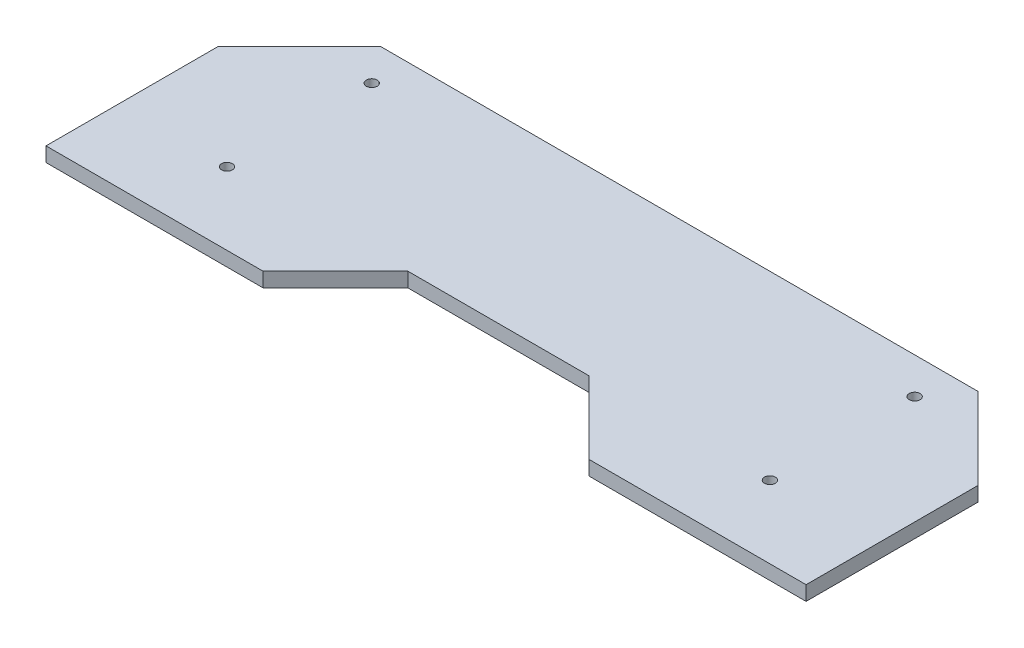
ISO-10303-21;
HEADER;
FILE_DESCRIPTION(('STEP AP214'),'2;1');
FILE_NAME('part.step','',(''),(''),'','','');
FILE_SCHEMA(('AUTOMOTIVE_DESIGN { 1 0 10303 214 1 1 1 1 }'));
ENDSEC;
DATA;
#1=APPLICATION_CONTEXT('core data for automotive mechanical design processes');
#2=APPLICATION_PROTOCOL_DEFINITION('international standard','automotive_design',2000,#1);
#3=PRODUCT_CONTEXT('',#1,'mechanical');
#4=PRODUCT('Part','Part','',(#3));
#5=PRODUCT_RELATED_PRODUCT_CATEGORY('part','',(#4));
#6=PRODUCT_DEFINITION_FORMATION('','',#4);
#7=PRODUCT_DEFINITION_CONTEXT('part definition',#1,'design');
#8=PRODUCT_DEFINITION('design','',#6,#7);
#9=PRODUCT_DEFINITION_SHAPE('','',#8);
#10=(LENGTH_UNIT() NAMED_UNIT(*) SI_UNIT(.MILLI.,.METRE.));
#11=(NAMED_UNIT(*) PLANE_ANGLE_UNIT() SI_UNIT($,.RADIAN.));
#12=(NAMED_UNIT(*) SI_UNIT($,.STERADIAN.) SOLID_ANGLE_UNIT());
#13=UNCERTAINTY_MEASURE_WITH_UNIT(LENGTH_MEASURE(1.E-05),#10,'distance_accuracy_value','');
#14=(GEOMETRIC_REPRESENTATION_CONTEXT(3) GLOBAL_UNCERTAINTY_ASSIGNED_CONTEXT((#13)) GLOBAL_UNIT_ASSIGNED_CONTEXT((#10,
#11,#12)) REPRESENTATION_CONTEXT('',''));
#15=CARTESIAN_POINT('',(0.,0.,0.));
#16=DIRECTION('',(0.,0.,1.));
#17=DIRECTION('',(1.,0.,0.));
#18=AXIS2_PLACEMENT_3D('',#15,#16,#17);
#19=CARTESIAN_POINT('',(-137.5,4.,35.));
#20=DIRECTION('',(0.,0.,-1.));
#21=DIRECTION('',(-1.,0.,0.));
#22=AXIS2_PLACEMENT_3D('',#19,#20,#21);
#23=PLANE('',#22);
#24=DIRECTION('',(1.,0.,0.));
#25=VECTOR('',#24,1.);
#26=CARTESIAN_POINT('',(-137.5,4.,35.));
#27=LINE('',#26,#25);
#28=CARTESIAN_POINT('',(-127.5,4.,35.));
#29=VERTEX_POINT('',#28);
#30=CARTESIAN_POINT('',(-67.4999999999999,4.,35.));
#31=VERTEX_POINT('',#30);
#32=EDGE_CURVE('E173',#29,#31,#27,.T.);
#33=ORIENTED_EDGE('',*,*,#32,.F.);
#34=DIRECTION('',(0.,1.,0.));
#35=VECTOR('',#34,1.);
#36=CARTESIAN_POINT('',(-127.5,0.,35.));
#37=LINE('',#36,#35);
#38=CARTESIAN_POINT('',(-127.5,0.,35.));
#39=VERTEX_POINT('',#38);
#40=EDGE_CURVE('E145',#39,#29,#37,.T.);
#41=ORIENTED_EDGE('',*,*,#40,.F.);
#42=DIRECTION('',(1.,0.,0.));
#43=VECTOR('',#42,1.);
#44=CARTESIAN_POINT('',(-137.5,0.,35.));
#45=LINE('',#44,#43);
#46=CARTESIAN_POINT('',(-67.4999999999999,0.,35.));
#47=VERTEX_POINT('',#46);
#48=EDGE_CURVE('E170',#39,#47,#45,.T.);
#49=ORIENTED_EDGE('',*,*,#48,.T.);
#50=DIRECTION('',(0.,-1.,0.));
#51=VECTOR('',#50,1.);
#52=CARTESIAN_POINT('',(-67.4999999999999,4.,35.));
#53=LINE('',#52,#51);
#54=EDGE_CURVE('E43',#31,#47,#53,.T.);
#55=ORIENTED_EDGE('',*,*,#54,.F.);
#56=EDGE_LOOP('',(#33,#41,#49,#55));
#57=FACE_BOUND('',#56,.T.);
#58=ADVANCED_FACE('F36',(#57),#23,.F.);
#59=CARTESIAN_POINT('',(-67.4999999999999,4.,35.));
#60=DIRECTION('',(-0.70710678118655,0.,-0.707106781186545));
#61=DIRECTION('',(-0.707106781186545,0.,0.70710678118655));
#62=AXIS2_PLACEMENT_3D('',#59,#60,#61);
#63=PLANE('',#62);
#64=DIRECTION('',(0.707106781186545,0.,-0.70710678118655));
#65=VECTOR('',#64,1.);
#66=CARTESIAN_POINT('',(-67.4999999999999,0.,35.));
#67=LINE('',#66,#65);
#68=CARTESIAN_POINT('',(-47.5,0.,15.));
#69=VERTEX_POINT('',#68);
#70=EDGE_CURVE('E187',#47,#69,#67,.T.);
#71=ORIENTED_EDGE('',*,*,#70,.T.);
#72=DIRECTION('',(0.,-1.,0.));
#73=VECTOR('',#72,1.);
#74=CARTESIAN_POINT('',(-47.5,4.,15.));
#75=LINE('',#74,#73);
#76=CARTESIAN_POINT('',(-47.5,4.,15.));
#77=VERTEX_POINT('',#76);
#78=EDGE_CURVE('E201',#77,#69,#75,.T.);
#79=ORIENTED_EDGE('',*,*,#78,.F.);
#80=DIRECTION('',(0.707106781186545,0.,-0.70710678118655));
#81=VECTOR('',#80,1.);
#82=CARTESIAN_POINT('',(-67.4999999999999,4.,35.));
#83=LINE('',#82,#81);
#84=EDGE_CURVE('E175',#31,#77,#83,.T.);
#85=ORIENTED_EDGE('',*,*,#84,.F.);
#86=ORIENTED_EDGE('',*,*,#54,.T.);
#87=EDGE_LOOP('',(#71,#79,#85,#86));
#88=FACE_BOUND('',#87,.T.);
#89=ADVANCED_FACE('F208',(#88),#63,.F.);
#90=CARTESIAN_POINT('',(-47.5,4.,15.));
#91=DIRECTION('',(0.,0.,-1.));
#92=DIRECTION('',(-1.,0.,0.));
#93=AXIS2_PLACEMENT_3D('',#90,#91,#92);
#94=PLANE('',#93);
#95=DIRECTION('',(1.,0.,0.));
#96=VECTOR('',#95,1.);
#97=CARTESIAN_POINT('',(-47.5,0.,15.));
#98=LINE('',#97,#96);
#99=CARTESIAN_POINT('',(2.49999999999997,0.,15.));
#100=VERTEX_POINT('',#99);
#101=EDGE_CURVE('E189',#69,#100,#98,.T.);
#102=ORIENTED_EDGE('',*,*,#101,.T.);
#103=DIRECTION('',(0.,-1.,0.));
#104=VECTOR('',#103,1.);
#105=CARTESIAN_POINT('',(2.49999999999997,4.,15.));
#106=LINE('',#105,#104);
#107=CARTESIAN_POINT('',(2.49999999999997,4.,15.));
#108=VERTEX_POINT('',#107);
#109=EDGE_CURVE('E198',#108,#100,#106,.T.);
#110=ORIENTED_EDGE('',*,*,#109,.F.);
#111=DIRECTION('',(1.,0.,0.));
#112=VECTOR('',#111,1.);
#113=CARTESIAN_POINT('',(-47.5,4.,15.));
#114=LINE('',#113,#112);
#115=EDGE_CURVE('E177',#77,#108,#114,.T.);
#116=ORIENTED_EDGE('',*,*,#115,.F.);
#117=ORIENTED_EDGE('',*,*,#78,.T.);
#118=EDGE_LOOP('',(#102,#110,#116,#117));
#119=FACE_BOUND('',#118,.T.);
#120=ADVANCED_FACE('F217',(#119),#94,.F.);
#121=CARTESIAN_POINT('',(22.5,4.,35.));
#122=DIRECTION('',(0.707106781186546,0.,-0.707106781186549));
#123=DIRECTION('',(-0.707106781186549,0.,-0.707106781186546));
#124=AXIS2_PLACEMENT_3D('',#121,#122,#123);
#125=PLANE('',#124);
#126=DIRECTION('',(0.707106781186549,0.,0.707106781186546));
#127=VECTOR('',#126,1.);
#128=CARTESIAN_POINT('',(22.5,0.,35.));
#129=LINE('',#128,#127);
#130=CARTESIAN_POINT('',(22.5,0.,35.));
#131=VERTEX_POINT('',#130);
#132=EDGE_CURVE('E191',#100,#131,#129,.T.);
#133=ORIENTED_EDGE('',*,*,#132,.T.);
#134=DIRECTION('',(0.,-1.,0.));
#135=VECTOR('',#134,1.);
#136=CARTESIAN_POINT('',(22.5,4.,35.));
#137=LINE('',#136,#135);
#138=CARTESIAN_POINT('',(22.5,4.,35.));
#139=VERTEX_POINT('',#138);
#140=EDGE_CURVE('E185',#139,#131,#137,.T.);
#141=ORIENTED_EDGE('',*,*,#140,.F.);
#142=DIRECTION('',(0.707106781186549,0.,0.707106781186546));
#143=VECTOR('',#142,1.);
#144=CARTESIAN_POINT('',(22.5,4.,35.));
#145=LINE('',#144,#143);
#146=EDGE_CURVE('E179',#108,#139,#145,.T.);
#147=ORIENTED_EDGE('',*,*,#146,.F.);
#148=ORIENTED_EDGE('',*,*,#109,.T.);
#149=EDGE_LOOP('',(#133,#141,#147,#148));
#150=FACE_BOUND('',#149,.T.);
#151=ADVANCED_FACE('F221',(#150),#125,.F.);
#152=CARTESIAN_POINT('',(22.5,4.,35.));
#153=DIRECTION('',(0.,0.,-1.));
#154=DIRECTION('',(-1.,0.,0.));
#155=AXIS2_PLACEMENT_3D('',#152,#153,#154);
#156=PLANE('',#155);
#157=DIRECTION('',(1.,0.,0.));
#158=VECTOR('',#157,1.);
#159=CARTESIAN_POINT('',(22.5,0.,35.));
#160=LINE('',#159,#158);
#161=CARTESIAN_POINT('',(82.5000000000001,0.,35.));
#162=VERTEX_POINT('',#161);
#163=EDGE_CURVE('E193',#131,#162,#160,.T.);
#164=ORIENTED_EDGE('',*,*,#163,.T.);
#165=DIRECTION('',(0.,1.,0.));
#166=VECTOR('',#165,1.);
#167=CARTESIAN_POINT('',(82.5000000000001,0.,35.));
#168=LINE('',#167,#166);
#169=CARTESIAN_POINT('',(82.5000000000001,4.,35.));
#170=VERTEX_POINT('',#169);
#171=EDGE_CURVE('E130',#162,#170,#168,.T.);
#172=ORIENTED_EDGE('',*,*,#171,.T.);
#173=DIRECTION('',(1.,0.,0.));
#174=VECTOR('',#173,1.);
#175=CARTESIAN_POINT('',(22.5,4.,35.));
#176=LINE('',#175,#174);
#177=EDGE_CURVE('E181',#139,#170,#176,.T.);
#178=ORIENTED_EDGE('',*,*,#177,.F.);
#179=ORIENTED_EDGE('',*,*,#140,.T.);
#180=EDGE_LOOP('',(#164,#172,#178,#179));
#181=FACE_BOUND('',#180,.T.);
#182=ADVANCED_FACE('F262',(#181),#156,.F.);
#183=CARTESIAN_POINT('',(-117.5,4.,-35.));
#184=DIRECTION('',(0.,0.,1.));
#185=DIRECTION('',(1.,0.,0.));
#186=AXIS2_PLACEMENT_3D('',#183,#184,#185);
#187=PLANE('',#186);
#188=DIRECTION('',(-1.,0.,0.));
#189=VECTOR('',#188,1.);
#190=CARTESIAN_POINT('',(-117.5,4.,-35.));
#191=LINE('',#190,#189);
#192=CARTESIAN_POINT('',(60.,4.,-35.));
#193=VERTEX_POINT('',#192);
#194=CARTESIAN_POINT('',(-105.,4.,-35.));
#195=VERTEX_POINT('',#194);
#196=EDGE_CURVE('E183',#193,#195,#191,.T.);
#197=ORIENTED_EDGE('',*,*,#196,.F.);
#198=DIRECTION('',(0.,-1.,0.));
#199=VECTOR('',#198,1.);
#200=CARTESIAN_POINT('',(60.,4.,-35.));
#201=LINE('',#200,#199);
#202=CARTESIAN_POINT('',(60.,0.,-35.));
#203=VERTEX_POINT('',#202);
#204=EDGE_CURVE('E117',#193,#203,#201,.T.);
#205=ORIENTED_EDGE('',*,*,#204,.T.);
#206=DIRECTION('',(-1.,0.,0.));
#207=VECTOR('',#206,1.);
#208=CARTESIAN_POINT('',(-117.5,0.,-35.));
#209=LINE('',#208,#207);
#210=CARTESIAN_POINT('',(-105.,0.,-35.));
#211=VERTEX_POINT('',#210);
#212=EDGE_CURVE('E126',#203,#211,#209,.T.);
#213=ORIENTED_EDGE('',*,*,#212,.T.);
#214=DIRECTION('',(0.,1.,0.));
#215=VECTOR('',#214,1.);
#216=CARTESIAN_POINT('',(-105.,4.,-35.));
#217=LINE('',#216,#215);
#218=EDGE_CURVE('E140',#211,#195,#217,.T.);
#219=ORIENTED_EDGE('',*,*,#218,.T.);
#220=EDGE_LOOP('',(#197,#205,#213,#219));
#221=FACE_BOUND('',#220,.T.);
#222=ADVANCED_FACE('F240',(#221),#187,.F.);
#223=CARTESIAN_POINT('',(0.,4.,0.));
#224=DIRECTION('',(0.,-1.,0.));
#225=DIRECTION('',(0.,0.,-1.));
#226=AXIS2_PLACEMENT_3D('',#223,#224,#225);
#227=PLANE('',#226);
#228=CARTESIAN_POINT('',(-97.5,4.,-25.));
#229=DIRECTION('',(0.,1.,0.));
#230=DIRECTION('',(0.,0.,1.));
#231=AXIS2_PLACEMENT_3D('',#228,#229,#230);
#232=CIRCLE('',#231,1.5);
#233=CARTESIAN_POINT('',(-97.5,4.,-23.5));
#234=VERTEX_POINT('',#233);
#235=EDGE_CURVE('E153',#234,#234,#232,.T.);
#236=ORIENTED_EDGE('',*,*,#235,.F.);
#237=EDGE_LOOP('',(#236));
#238=FACE_BOUND('',#237,.T.);
#239=CARTESIAN_POINT('',(52.5000000000001,4.,-25.));
#240=DIRECTION('',(0.,1.,0.));
#241=DIRECTION('',(0.,0.,-1.));
#242=AXIS2_PLACEMENT_3D('',#239,#240,#241);
#243=CIRCLE('',#242,1.5);
#244=CARTESIAN_POINT('',(52.5000000000001,4.,-26.5));
#245=VERTEX_POINT('',#244);
#246=EDGE_CURVE('E159',#245,#245,#243,.T.);
#247=ORIENTED_EDGE('',*,*,#246,.F.);
#248=EDGE_LOOP('',(#247));
#249=FACE_BOUND('',#248,.T.);
#250=CARTESIAN_POINT('',(52.5000000000001,4.,15.));
#251=DIRECTION('',(0.,1.,0.));
#252=DIRECTION('',(0.,0.,-1.));
#253=AXIS2_PLACEMENT_3D('',#250,#251,#252);
#254=CIRCLE('',#253,1.5);
#255=CARTESIAN_POINT('',(52.5000000000001,4.,13.5));
#256=VERTEX_POINT('',#255);
#257=EDGE_CURVE('E148',#256,#256,#254,.T.);
#258=ORIENTED_EDGE('',*,*,#257,.F.);
#259=EDGE_LOOP('',(#258));
#260=FACE_BOUND('',#259,.T.);
#261=CARTESIAN_POINT('',(-97.5,4.,15.));
#262=DIRECTION('',(0.,1.,0.));
#263=DIRECTION('',(0.,0.,1.));
#264=AXIS2_PLACEMENT_3D('',#261,#262,#263);
#265=CIRCLE('',#264,1.5);
#266=CARTESIAN_POINT('',(-97.5,4.,16.5));
#267=VERTEX_POINT('',#266);
#268=EDGE_CURVE('E152',#267,#267,#265,.T.);
#269=ORIENTED_EDGE('',*,*,#268,.F.);
#270=EDGE_LOOP('',(#269));
#271=FACE_BOUND('',#270,.T.);
#272=DIRECTION('',(0.,0.,1.));
#273=VECTOR('',#272,1.);
#274=CARTESIAN_POINT('',(82.5000000000001,4.,35.));
#275=LINE('',#274,#273);
#276=CARTESIAN_POINT('',(82.5000000000001,4.,-12.5));
#277=VERTEX_POINT('',#276);
#278=EDGE_CURVE('E131',#277,#170,#275,.T.);
#279=ORIENTED_EDGE('',*,*,#278,.F.);
#280=DIRECTION('',(0.707106781186549,0.,0.707106781186546));
#281=VECTOR('',#280,1.);
#282=CARTESIAN_POINT('',(82.5000000000001,4.,-12.5));
#283=LINE('',#282,#281);
#284=EDGE_CURVE('E50',#193,#277,#283,.T.);
#285=ORIENTED_EDGE('',*,*,#284,.F.);
#286=ORIENTED_EDGE('',*,*,#196,.T.);
#287=DIRECTION('',(0.707106781186546,0.,-0.707106781186549));
#288=VECTOR('',#287,1.);
#289=CARTESIAN_POINT('',(-127.5,4.,-12.5));
#290=LINE('',#289,#288);
#291=CARTESIAN_POINT('',(-127.5,4.,-12.5));
#292=VERTEX_POINT('',#291);
#293=EDGE_CURVE('E231',#292,#195,#290,.T.);
#294=ORIENTED_EDGE('',*,*,#293,.F.);
#295=DIRECTION('',(0.,0.,-1.));
#296=VECTOR('',#295,1.);
#297=CARTESIAN_POINT('',(-127.5,4.,35.));
#298=LINE('',#297,#296);
#299=EDGE_CURVE('E135',#29,#292,#298,.T.);
#300=ORIENTED_EDGE('',*,*,#299,.F.);
#301=ORIENTED_EDGE('',*,*,#32,.T.);
#302=ORIENTED_EDGE('',*,*,#84,.T.);
#303=ORIENTED_EDGE('',*,*,#115,.T.);
#304=ORIENTED_EDGE('',*,*,#146,.T.);
#305=ORIENTED_EDGE('',*,*,#177,.T.);
#306=EDGE_LOOP('',(#279,#285,#286,#294,#300,#301,#302,#303,#304,#305));
#307=FACE_BOUND('',#306,.T.);
#308=ADVANCED_FACE('F224',(#238,#249,#260,#271,#307),#227,.F.);
#309=CARTESIAN_POINT('',(0.,0.,0.));
#310=DIRECTION('',(0.,-1.,0.));
#311=DIRECTION('',(0.,0.,-1.));
#312=AXIS2_PLACEMENT_3D('',#309,#310,#311);
#313=PLANE('',#312);
#314=DIRECTION('',(0.707106781186549,0.,0.707106781186546));
#315=VECTOR('',#314,1.);
#316=CARTESIAN_POINT('',(82.5000000000001,0.,-12.5));
#317=LINE('',#316,#315);
#318=CARTESIAN_POINT('',(82.5000000000001,0.,-12.5));
#319=VERTEX_POINT('',#318);
#320=EDGE_CURVE('E113',#203,#319,#317,.T.);
#321=ORIENTED_EDGE('',*,*,#320,.T.);
#322=DIRECTION('',(0.,0.,-1.));
#323=VECTOR('',#322,1.);
#324=CARTESIAN_POINT('',(82.5000000000001,0.,0.));
#325=LINE('',#324,#323);
#326=EDGE_CURVE('E11',#162,#319,#325,.T.);
#327=ORIENTED_EDGE('',*,*,#326,.F.);
#328=ORIENTED_EDGE('',*,*,#163,.F.);
#329=ORIENTED_EDGE('',*,*,#132,.F.);
#330=ORIENTED_EDGE('',*,*,#101,.F.);
#331=ORIENTED_EDGE('',*,*,#70,.F.);
#332=ORIENTED_EDGE('',*,*,#48,.F.);
#333=DIRECTION('',(0.,0.,-1.));
#334=VECTOR('',#333,1.);
#335=CARTESIAN_POINT('',(-127.5,0.,35.));
#336=LINE('',#335,#334);
#337=CARTESIAN_POINT('',(-127.5,0.,-12.5));
#338=VERTEX_POINT('',#337);
#339=EDGE_CURVE('E138',#39,#338,#336,.T.);
#340=ORIENTED_EDGE('',*,*,#339,.T.);
#341=DIRECTION('',(0.707106781186546,0.,-0.707106781186549));
#342=VECTOR('',#341,1.);
#343=CARTESIAN_POINT('',(-127.5,0.,-12.5));
#344=LINE('',#343,#342);
#345=EDGE_CURVE('E58',#338,#211,#344,.T.);
#346=ORIENTED_EDGE('',*,*,#345,.T.);
#347=ORIENTED_EDGE('',*,*,#212,.F.);
#348=EDGE_LOOP('',(#321,#327,#328,#329,#330,#331,#332,#340,#346,#347));
#349=FACE_BOUND('',#348,.T.);
#350=CARTESIAN_POINT('',(-97.5,0.,-25.));
#351=DIRECTION('',(0.,1.,0.));
#352=DIRECTION('',(0.,0.,1.));
#353=AXIS2_PLACEMENT_3D('',#350,#351,#352);
#354=CIRCLE('',#353,1.5);
#355=CARTESIAN_POINT('',(-97.5,0.,-23.5));
#356=VERTEX_POINT('',#355);
#357=EDGE_CURVE('E149',#356,#356,#354,.T.);
#358=ORIENTED_EDGE('',*,*,#357,.T.);
#359=EDGE_LOOP('',(#358));
#360=FACE_BOUND('',#359,.T.);
#361=CARTESIAN_POINT('',(52.5000000000001,0.,-25.));
#362=DIRECTION('',(0.,1.,0.));
#363=DIRECTION('',(0.,0.,-1.));
#364=AXIS2_PLACEMENT_3D('',#361,#362,#363);
#365=CIRCLE('',#364,1.5);
#366=CARTESIAN_POINT('',(52.5000000000001,0.,-26.5));
#367=VERTEX_POINT('',#366);
#368=EDGE_CURVE('E156',#367,#367,#365,.T.);
#369=ORIENTED_EDGE('',*,*,#368,.T.);
#370=EDGE_LOOP('',(#369));
#371=FACE_BOUND('',#370,.T.);
#372=CARTESIAN_POINT('',(52.5000000000001,0.,15.));
#373=DIRECTION('',(0.,1.,0.));
#374=DIRECTION('',(0.,0.,-1.));
#375=AXIS2_PLACEMENT_3D('',#372,#373,#374);
#376=CIRCLE('',#375,1.5);
#377=CARTESIAN_POINT('',(52.5000000000001,0.,13.5));
#378=VERTEX_POINT('',#377);
#379=EDGE_CURVE('E162',#378,#378,#376,.T.);
#380=ORIENTED_EDGE('',*,*,#379,.T.);
#381=EDGE_LOOP('',(#380));
#382=FACE_BOUND('',#381,.T.);
#383=CARTESIAN_POINT('',(-97.5,0.,15.));
#384=DIRECTION('',(0.,1.,0.));
#385=DIRECTION('',(0.,0.,1.));
#386=AXIS2_PLACEMENT_3D('',#383,#384,#385);
#387=CIRCLE('',#386,1.5);
#388=CARTESIAN_POINT('',(-97.5,0.,16.5));
#389=VERTEX_POINT('',#388);
#390=EDGE_CURVE('E167',#389,#389,#387,.T.);
#391=ORIENTED_EDGE('',*,*,#390,.T.);
#392=EDGE_LOOP('',(#391));
#393=FACE_BOUND('',#392,.T.);
#394=ADVANCED_FACE('F122',(#349,#360,#371,#382,#393),#313,.T.);
#395=CARTESIAN_POINT('',(-97.5,0.,15.));
#396=DIRECTION('',(0.,1.,0.));
#397=DIRECTION('',(0.,0.,1.));
#398=AXIS2_PLACEMENT_3D('',#395,#396,#397);
#399=CYLINDRICAL_SURFACE('',#398,1.5);
#400=ORIENTED_EDGE('',*,*,#390,.F.);
#401=EDGE_LOOP('',(#400));
#402=FACE_BOUND('',#401,.T.);
#403=ORIENTED_EDGE('',*,*,#268,.T.);
#404=EDGE_LOOP('',(#403));
#405=FACE_BOUND('',#404,.T.);
#406=ADVANCED_FACE('F269',(#402,#405),#399,.F.);
#407=CARTESIAN_POINT('',(52.5000000000001,0.,15.));
#408=DIRECTION('',(0.,1.,0.));
#409=DIRECTION('',(0.,0.,1.));
#410=AXIS2_PLACEMENT_3D('',#407,#408,#409);
#411=CYLINDRICAL_SURFACE('',#410,1.5);
#412=ORIENTED_EDGE('',*,*,#379,.F.);
#413=EDGE_LOOP('',(#412));
#414=FACE_BOUND('',#413,.T.);
#415=ORIENTED_EDGE('',*,*,#257,.T.);
#416=EDGE_LOOP('',(#415));
#417=FACE_BOUND('',#416,.T.);
#418=ADVANCED_FACE('F275',(#414,#417),#411,.F.);
#419=CARTESIAN_POINT('',(52.5000000000001,0.,-25.));
#420=DIRECTION('',(0.,1.,0.));
#421=DIRECTION('',(0.,0.,1.));
#422=AXIS2_PLACEMENT_3D('',#419,#420,#421);
#423=CYLINDRICAL_SURFACE('',#422,1.5);
#424=ORIENTED_EDGE('',*,*,#368,.F.);
#425=EDGE_LOOP('',(#424));
#426=FACE_BOUND('',#425,.T.);
#427=ORIENTED_EDGE('',*,*,#246,.T.);
#428=EDGE_LOOP('',(#427));
#429=FACE_BOUND('',#428,.T.);
#430=ADVANCED_FACE('F279',(#426,#429),#423,.F.);
#431=CARTESIAN_POINT('',(-97.5,0.,-25.));
#432=DIRECTION('',(0.,1.,0.));
#433=DIRECTION('',(0.,0.,1.));
#434=AXIS2_PLACEMENT_3D('',#431,#432,#433);
#435=CYLINDRICAL_SURFACE('',#434,1.5);
#436=ORIENTED_EDGE('',*,*,#357,.F.);
#437=EDGE_LOOP('',(#436));
#438=FACE_BOUND('',#437,.T.);
#439=ORIENTED_EDGE('',*,*,#235,.T.);
#440=EDGE_LOOP('',(#439));
#441=FACE_BOUND('',#440,.T.);
#442=ADVANCED_FACE('F283',(#438,#441),#435,.F.);
#443=CARTESIAN_POINT('',(-127.5,0.,35.));
#444=DIRECTION('',(1.,0.,0.));
#445=DIRECTION('',(0.,0.,-1.));
#446=AXIS2_PLACEMENT_3D('',#443,#444,#445);
#447=PLANE('',#446);
#448=ORIENTED_EDGE('',*,*,#299,.T.);
#449=DIRECTION('',(0.,1.,0.));
#450=VECTOR('',#449,1.);
#451=CARTESIAN_POINT('',(-127.5,0.,-12.5));
#452=LINE('',#451,#450);
#453=EDGE_CURVE('E230',#338,#292,#452,.T.);
#454=ORIENTED_EDGE('',*,*,#453,.F.);
#455=ORIENTED_EDGE('',*,*,#339,.F.);
#456=ORIENTED_EDGE('',*,*,#40,.T.);
#457=EDGE_LOOP('',(#448,#454,#455,#456));
#458=FACE_BOUND('',#457,.T.);
#459=ADVANCED_FACE('F229',(#458),#447,.F.);
#460=CARTESIAN_POINT('',(82.5000000000001,0.,35.));
#461=DIRECTION('',(-1.,0.,0.));
#462=DIRECTION('',(0.,0.,1.));
#463=AXIS2_PLACEMENT_3D('',#460,#461,#462);
#464=PLANE('',#463);
#465=ORIENTED_EDGE('',*,*,#326,.T.);
#466=DIRECTION('',(0.,1.,0.));
#467=VECTOR('',#466,1.);
#468=CARTESIAN_POINT('',(82.5000000000001,0.,-12.5));
#469=LINE('',#468,#467);
#470=EDGE_CURVE('E110',#319,#277,#469,.T.);
#471=ORIENTED_EDGE('',*,*,#470,.T.);
#472=ORIENTED_EDGE('',*,*,#278,.T.);
#473=ORIENTED_EDGE('',*,*,#171,.F.);
#474=EDGE_LOOP('',(#465,#471,#472,#473));
#475=FACE_BOUND('',#474,.T.);
#476=ADVANCED_FACE('F128',(#475),#464,.F.);
#477=CARTESIAN_POINT('',(-127.5,0.,-12.5));
#478=DIRECTION('',(0.707106781186549,0.,0.707106781186546));
#479=DIRECTION('',(0.707106781186546,0.,-0.707106781186549));
#480=AXIS2_PLACEMENT_3D('',#477,#478,#479);
#481=PLANE('',#480);
#482=ORIENTED_EDGE('',*,*,#345,.F.);
#483=ORIENTED_EDGE('',*,*,#453,.T.);
#484=ORIENTED_EDGE('',*,*,#293,.T.);
#485=ORIENTED_EDGE('',*,*,#218,.F.);
#486=EDGE_LOOP('',(#482,#483,#484,#485));
#487=FACE_BOUND('',#486,.T.);
#488=ADVANCED_FACE('F241',(#487),#481,.F.);
#489=CARTESIAN_POINT('',(82.5000000000001,0.,-12.5));
#490=DIRECTION('',(-0.707106781186546,0.,0.707106781186549));
#491=DIRECTION('',(0.707106781186549,0.,0.707106781186546));
#492=AXIS2_PLACEMENT_3D('',#489,#490,#491);
#493=PLANE('',#492);
#494=ORIENTED_EDGE('',*,*,#284,.T.);
#495=ORIENTED_EDGE('',*,*,#470,.F.);
#496=ORIENTED_EDGE('',*,*,#320,.F.);
#497=ORIENTED_EDGE('',*,*,#204,.F.);
#498=EDGE_LOOP('',(#494,#495,#496,#497));
#499=FACE_BOUND('',#498,.T.);
#500=ADVANCED_FACE('F112',(#499),#493,.F.);
#501=CLOSED_SHELL('',(#58,#89,#120,#151,#182,#222,#308,#394,#406,#418,#430,#442,#459,#476,#488,#500));
#502=MANIFOLD_SOLID_BREP('B2',#501);
#503=ADVANCED_BREP_SHAPE_REPRESENTATION('',(#18,#502),#14);
#504=SHAPE_DEFINITION_REPRESENTATION(#9,#503);
ENDSEC;
END-ISO-10303-21;
